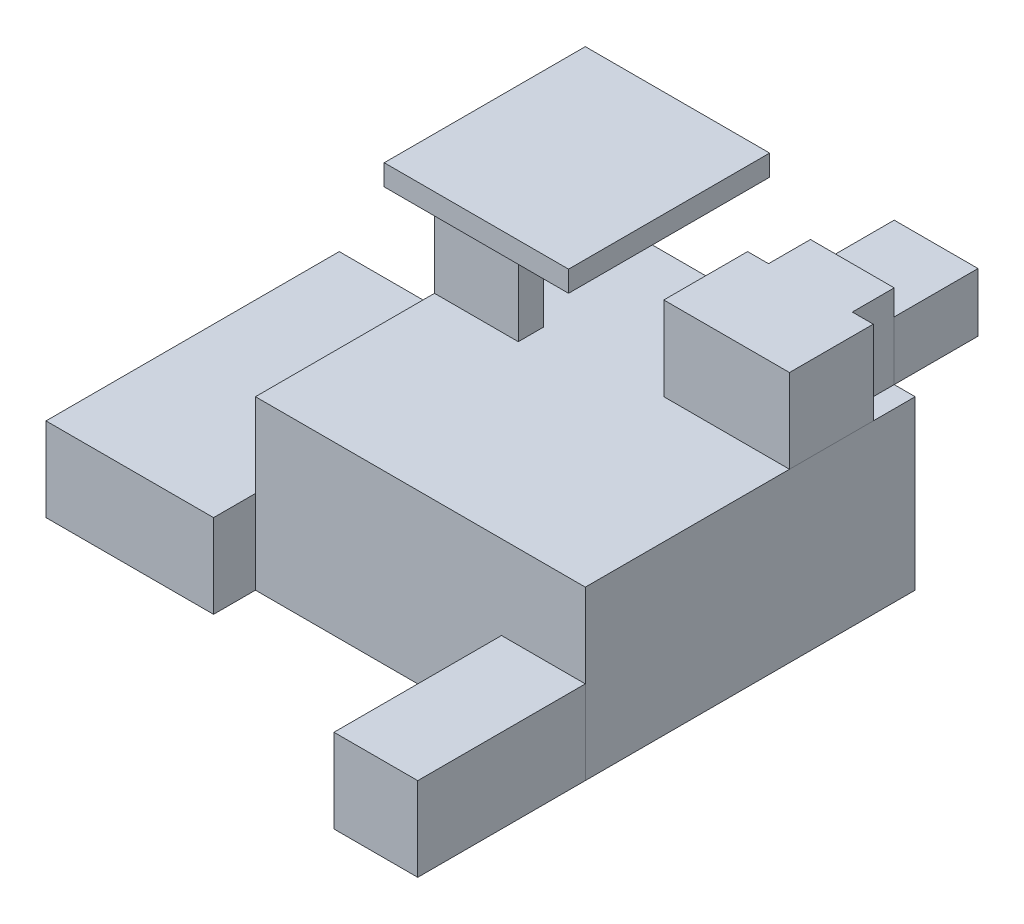
ISO-10303-21;
HEADER;
FILE_DESCRIPTION(('STEP AP214'),'2;1');
FILE_NAME('part.step','',(''),(''),'','','');
FILE_SCHEMA(('AUTOMOTIVE_DESIGN { 1 0 10303 214 1 1 1 1 }'));
ENDSEC;
DATA;
#1=APPLICATION_CONTEXT('core data for automotive mechanical design processes');
#2=APPLICATION_PROTOCOL_DEFINITION('international standard','automotive_design',2000,#1);
#3=PRODUCT_CONTEXT('',#1,'mechanical');
#4=PRODUCT('Part','Part','',(#3));
#5=PRODUCT_RELATED_PRODUCT_CATEGORY('part','',(#4));
#6=PRODUCT_DEFINITION_FORMATION('','',#4);
#7=PRODUCT_DEFINITION_CONTEXT('part definition',#1,'design');
#8=PRODUCT_DEFINITION('design','',#6,#7);
#9=PRODUCT_DEFINITION_SHAPE('','',#8);
#10=(LENGTH_UNIT() NAMED_UNIT(*) SI_UNIT(.MILLI.,.METRE.));
#11=(NAMED_UNIT(*) PLANE_ANGLE_UNIT() SI_UNIT($,.RADIAN.));
#12=(NAMED_UNIT(*) SI_UNIT($,.STERADIAN.) SOLID_ANGLE_UNIT());
#13=UNCERTAINTY_MEASURE_WITH_UNIT(LENGTH_MEASURE(1.E-05),#10,'distance_accuracy_value','');
#14=(GEOMETRIC_REPRESENTATION_CONTEXT(3) GLOBAL_UNCERTAINTY_ASSIGNED_CONTEXT((#13)) GLOBAL_UNIT_ASSIGNED_CONTEXT((#10,
#11,#12)) REPRESENTATION_CONTEXT('',''));
#15=CARTESIAN_POINT('',(0.,0.,0.));
#16=DIRECTION('',(0.,0.,1.));
#17=DIRECTION('',(1.,0.,0.));
#18=AXIS2_PLACEMENT_3D('',#15,#16,#17);
#19=CARTESIAN_POINT('',(21.59,40.005,-25.87));
#20=DIRECTION('',(-1.,0.,0.));
#21=DIRECTION('',(0.,0.,1.));
#22=AXIS2_PLACEMENT_3D('',#19,#20,#21);
#23=PLANE('',#22);
#24=DIRECTION('',(0.,0.,-1.));
#25=VECTOR('',#24,1.);
#26=CARTESIAN_POINT('',(21.59,36.83,-25.87));
#27=LINE('',#26,#25);
#28=CARTESIAN_POINT('',(21.59,36.83,-25.87));
#29=VERTEX_POINT('',#28);
#30=CARTESIAN_POINT('',(21.59,36.83,-56.35));
#31=VERTEX_POINT('',#30);
#32=EDGE_CURVE('E106',#29,#31,#27,.T.);
#33=ORIENTED_EDGE('',*,*,#32,.T.);
#34=DIRECTION('',(0.,-1.,0.));
#35=VECTOR('',#34,1.);
#36=CARTESIAN_POINT('',(21.59,40.005,-56.35));
#37=LINE('',#36,#35);
#38=CARTESIAN_POINT('',(21.59,40.005,-56.35));
#39=VERTEX_POINT('',#38);
#40=EDGE_CURVE('E12',#39,#31,#37,.T.);
#41=ORIENTED_EDGE('',*,*,#40,.F.);
#42=DIRECTION('',(0.,0.,-1.));
#43=VECTOR('',#42,1.);
#44=CARTESIAN_POINT('',(21.59,40.005,-25.87));
#45=LINE('',#44,#43);
#46=CARTESIAN_POINT('',(21.59,40.005,-25.87));
#47=VERTEX_POINT('',#46);
#48=EDGE_CURVE('E94',#47,#39,#45,.T.);
#49=ORIENTED_EDGE('',*,*,#48,.F.);
#50=DIRECTION('',(0.,-1.,0.));
#51=VECTOR('',#50,1.);
#52=CARTESIAN_POINT('',(21.59,40.005,-25.87));
#53=LINE('',#52,#51);
#54=EDGE_CURVE('E102',#47,#29,#53,.T.);
#55=ORIENTED_EDGE('',*,*,#54,.T.);
#56=EDGE_LOOP('',(#33,#41,#49,#55));
#57=FACE_BOUND('',#56,.T.);
#58=ADVANCED_FACE('F43',(#57),#23,.F.);
#59=CARTESIAN_POINT('',(21.59,40.005,-56.35));
#60=DIRECTION('',(0.,0.,1.));
#61=DIRECTION('',(1.,0.,0.));
#62=AXIS2_PLACEMENT_3D('',#59,#60,#61);
#63=PLANE('',#62);
#64=DIRECTION('',(-1.,0.,0.));
#65=VECTOR('',#64,1.);
#66=CARTESIAN_POINT('',(21.59,36.83,-56.35));
#67=LINE('',#66,#65);
#68=CARTESIAN_POINT('',(-6.35,36.83,-56.35));
#69=VERTEX_POINT('',#68);
#70=EDGE_CURVE('E98',#31,#69,#67,.T.);
#71=ORIENTED_EDGE('',*,*,#70,.T.);
#72=DIRECTION('',(0.,-1.,0.));
#73=VECTOR('',#72,1.);
#74=CARTESIAN_POINT('',(-6.35,40.005,-56.35));
#75=LINE('',#74,#73);
#76=CARTESIAN_POINT('',(-6.35,40.005,-56.35));
#77=VERTEX_POINT('',#76);
#78=EDGE_CURVE('E51',#77,#69,#75,.T.);
#79=ORIENTED_EDGE('',*,*,#78,.F.);
#80=DIRECTION('',(-1.,0.,0.));
#81=VECTOR('',#80,1.);
#82=CARTESIAN_POINT('',(21.59,40.005,-56.35));
#83=LINE('',#82,#81);
#84=EDGE_CURVE('E89',#39,#77,#83,.T.);
#85=ORIENTED_EDGE('',*,*,#84,.F.);
#86=ORIENTED_EDGE('',*,*,#40,.T.);
#87=EDGE_LOOP('',(#71,#79,#85,#86));
#88=FACE_BOUND('',#87,.T.);
#89=ADVANCED_FACE('F97',(#88),#63,.F.);
#90=CARTESIAN_POINT('',(-6.35,40.005,-25.87));
#91=DIRECTION('',(1.,0.,0.));
#92=DIRECTION('',(0.,0.,-1.));
#93=AXIS2_PLACEMENT_3D('',#90,#91,#92);
#94=PLANE('',#93);
#95=DIRECTION('',(0.,0.,1.));
#96=VECTOR('',#95,1.);
#97=CARTESIAN_POINT('',(-6.35,36.83,-25.87));
#98=LINE('',#97,#96);
#99=CARTESIAN_POINT('',(-6.35,36.83,-25.87));
#100=VERTEX_POINT('',#99);
#101=EDGE_CURVE('E76',#69,#100,#98,.T.);
#102=ORIENTED_EDGE('',*,*,#101,.T.);
#103=DIRECTION('',(0.,-1.,0.));
#104=VECTOR('',#103,1.);
#105=CARTESIAN_POINT('',(-6.35,40.005,-25.87));
#106=LINE('',#105,#104);
#107=CARTESIAN_POINT('',(-6.35,40.005,-25.87));
#108=VERTEX_POINT('',#107);
#109=EDGE_CURVE('E99',#108,#100,#106,.T.);
#110=ORIENTED_EDGE('',*,*,#109,.F.);
#111=DIRECTION('',(0.,0.,1.));
#112=VECTOR('',#111,1.);
#113=CARTESIAN_POINT('',(-6.35,40.005,-25.87));
#114=LINE('',#113,#112);
#115=EDGE_CURVE('E92',#77,#108,#114,.T.);
#116=ORIENTED_EDGE('',*,*,#115,.F.);
#117=ORIENTED_EDGE('',*,*,#78,.T.);
#118=EDGE_LOOP('',(#102,#110,#116,#117));
#119=FACE_BOUND('',#118,.T.);
#120=ADVANCED_FACE('F100',(#119),#94,.F.);
#121=CARTESIAN_POINT('',(21.59,40.005,-25.87));
#122=DIRECTION('',(0.,0.,-1.));
#123=DIRECTION('',(-1.,0.,0.));
#124=AXIS2_PLACEMENT_3D('',#121,#122,#123);
#125=PLANE('',#124);
#126=DIRECTION('',(1.,0.,0.));
#127=VECTOR('',#126,1.);
#128=CARTESIAN_POINT('',(21.59,36.83,-25.87));
#129=LINE('',#128,#127);
#130=EDGE_CURVE('E82',#100,#29,#129,.T.);
#131=ORIENTED_EDGE('',*,*,#130,.T.);
#132=ORIENTED_EDGE('',*,*,#54,.F.);
#133=DIRECTION('',(1.,0.,0.));
#134=VECTOR('',#133,1.);
#135=CARTESIAN_POINT('',(21.59,40.005,-25.87));
#136=LINE('',#135,#134);
#137=EDGE_CURVE('E59',#108,#47,#136,.T.);
#138=ORIENTED_EDGE('',*,*,#137,.F.);
#139=ORIENTED_EDGE('',*,*,#109,.T.);
#140=EDGE_LOOP('',(#131,#132,#138,#139));
#141=FACE_BOUND('',#140,.T.);
#142=ADVANCED_FACE('F113',(#141),#125,.F.);
#143=CARTESIAN_POINT('',(0.,40.005,0.));
#144=DIRECTION('',(0.,1.,0.));
#145=DIRECTION('',(0.,0.,1.));
#146=AXIS2_PLACEMENT_3D('',#143,#144,#145);
#147=PLANE('',#146);
#148=ORIENTED_EDGE('',*,*,#48,.T.);
#149=ORIENTED_EDGE('',*,*,#84,.T.);
#150=ORIENTED_EDGE('',*,*,#115,.T.);
#151=ORIENTED_EDGE('',*,*,#137,.T.);
#152=EDGE_LOOP('',(#148,#149,#150,#151));
#153=FACE_BOUND('',#152,.T.);
#154=ADVANCED_FACE('F90',(#153),#147,.T.);
#155=CARTESIAN_POINT('',(0.,36.83,0.));
#156=DIRECTION('',(0.,1.,0.));
#157=DIRECTION('',(0.,0.,1.));
#158=AXIS2_PLACEMENT_3D('',#155,#156,#157);
#159=PLANE('',#158);
#160=ORIENTED_EDGE('',*,*,#32,.F.);
#161=ORIENTED_EDGE('',*,*,#130,.F.);
#162=ORIENTED_EDGE('',*,*,#101,.F.);
#163=ORIENTED_EDGE('',*,*,#70,.F.);
#164=EDGE_LOOP('',(#160,#161,#162,#163));
#165=FACE_BOUND('',#164,.T.);
#166=ADVANCED_FACE('F116',(#165),#159,.F.);
#167=CLOSED_SHELL('',(#58,#89,#120,#142,#154,#166));
#168=MANIFOLD_SOLID_BREP('B2',#167);
#169=CARTESIAN_POINT('',(12.7,36.83,-30.95));
#170=DIRECTION('',(-1.,0.,0.));
#171=DIRECTION('',(0.,0.,1.));
#172=AXIS2_PLACEMENT_3D('',#169,#170,#171);
#173=PLANE('',#172);
#174=DIRECTION('',(0.,0.,-1.));
#175=VECTOR('',#174,1.);
#176=CARTESIAN_POINT('',(12.7,25.4,-30.95));
#177=LINE('',#176,#175);
#178=CARTESIAN_POINT('',(12.7,25.4,-27.14));
#179=VERTEX_POINT('',#178);
#180=CARTESIAN_POINT('',(12.7,25.4,-30.95));
#181=VERTEX_POINT('',#180);
#182=EDGE_CURVE('E239',#179,#181,#177,.T.);
#183=ORIENTED_EDGE('',*,*,#182,.T.);
#184=DIRECTION('',(0.,-1.,0.));
#185=VECTOR('',#184,1.);
#186=CARTESIAN_POINT('',(12.7,36.83,-30.95));
#187=LINE('',#186,#185);
#188=CARTESIAN_POINT('',(12.7,36.83,-30.95));
#189=VERTEX_POINT('',#188);
#190=EDGE_CURVE('E41',#189,#181,#187,.T.);
#191=ORIENTED_EDGE('',*,*,#190,.F.);
#192=DIRECTION('',(0.,0.,-1.));
#193=VECTOR('',#192,1.);
#194=CARTESIAN_POINT('',(12.7,36.83,-30.95));
#195=LINE('',#194,#193);
#196=CARTESIAN_POINT('',(12.7,36.83,-27.14));
#197=VERTEX_POINT('',#196);
#198=EDGE_CURVE('E227',#197,#189,#195,.T.);
#199=ORIENTED_EDGE('',*,*,#198,.F.);
#200=DIRECTION('',(0.,-1.,0.));
#201=VECTOR('',#200,1.);
#202=CARTESIAN_POINT('',(12.7,36.83,-27.14));
#203=LINE('',#202,#201);
#204=EDGE_CURVE('E235',#197,#179,#203,.T.);
#205=ORIENTED_EDGE('',*,*,#204,.T.);
#206=EDGE_LOOP('',(#183,#191,#199,#205));
#207=FACE_BOUND('',#206,.T.);
#208=ADVANCED_FACE('F176',(#207),#173,.F.);
#209=CARTESIAN_POINT('',(12.7,36.83,-30.95));
#210=DIRECTION('',(0.,0.,1.));
#211=DIRECTION('',(1.,0.,0.));
#212=AXIS2_PLACEMENT_3D('',#209,#210,#211);
#213=PLANE('',#212);
#214=DIRECTION('',(-1.,0.,0.));
#215=VECTOR('',#214,1.);
#216=CARTESIAN_POINT('',(12.7,25.4,-30.95));
#217=LINE('',#216,#215);
#218=CARTESIAN_POINT('',(0.,25.4,-30.95));
#219=VERTEX_POINT('',#218);
#220=EDGE_CURVE('E231',#181,#219,#217,.T.);
#221=ORIENTED_EDGE('',*,*,#220,.T.);
#222=DIRECTION('',(0.,-1.,0.));
#223=VECTOR('',#222,1.);
#224=CARTESIAN_POINT('',(0.,36.83,-30.95));
#225=LINE('',#224,#223);
#226=CARTESIAN_POINT('',(0.,36.83,-30.95));
#227=VERTEX_POINT('',#226);
#228=EDGE_CURVE('E184',#227,#219,#225,.T.);
#229=ORIENTED_EDGE('',*,*,#228,.F.);
#230=DIRECTION('',(-1.,0.,0.));
#231=VECTOR('',#230,1.);
#232=CARTESIAN_POINT('',(12.7,36.83,-30.95));
#233=LINE('',#232,#231);
#234=EDGE_CURVE('E222',#189,#227,#233,.T.);
#235=ORIENTED_EDGE('',*,*,#234,.F.);
#236=ORIENTED_EDGE('',*,*,#190,.T.);
#237=EDGE_LOOP('',(#221,#229,#235,#236));
#238=FACE_BOUND('',#237,.T.);
#239=ADVANCED_FACE('F230',(#238),#213,.F.);
#240=CARTESIAN_POINT('',(0.,36.83,-30.95));
#241=DIRECTION('',(1.,0.,0.));
#242=DIRECTION('',(0.,0.,-1.));
#243=AXIS2_PLACEMENT_3D('',#240,#241,#242);
#244=PLANE('',#243);
#245=DIRECTION('',(0.,0.,1.));
#246=VECTOR('',#245,1.);
#247=CARTESIAN_POINT('',(0.,25.4,-30.95));
#248=LINE('',#247,#246);
#249=CARTESIAN_POINT('',(0.,25.4,-27.14));
#250=VERTEX_POINT('',#249);
#251=EDGE_CURVE('E209',#219,#250,#248,.T.);
#252=ORIENTED_EDGE('',*,*,#251,.T.);
#253=DIRECTION('',(0.,-1.,0.));
#254=VECTOR('',#253,1.);
#255=CARTESIAN_POINT('',(0.,36.83,-27.14));
#256=LINE('',#255,#254);
#257=CARTESIAN_POINT('',(0.,36.83,-27.14));
#258=VERTEX_POINT('',#257);
#259=EDGE_CURVE('E232',#258,#250,#256,.T.);
#260=ORIENTED_EDGE('',*,*,#259,.F.);
#261=DIRECTION('',(0.,0.,1.));
#262=VECTOR('',#261,1.);
#263=CARTESIAN_POINT('',(0.,36.83,-30.95));
#264=LINE('',#263,#262);
#265=EDGE_CURVE('E225',#227,#258,#264,.T.);
#266=ORIENTED_EDGE('',*,*,#265,.F.);
#267=ORIENTED_EDGE('',*,*,#228,.T.);
#268=EDGE_LOOP('',(#252,#260,#266,#267));
#269=FACE_BOUND('',#268,.T.);
#270=ADVANCED_FACE('F233',(#269),#244,.F.);
#271=CARTESIAN_POINT('',(12.7,36.83,-27.14));
#272=DIRECTION('',(0.,0.,-1.));
#273=DIRECTION('',(-1.,0.,0.));
#274=AXIS2_PLACEMENT_3D('',#271,#272,#273);
#275=PLANE('',#274);
#276=DIRECTION('',(1.,0.,0.));
#277=VECTOR('',#276,1.);
#278=CARTESIAN_POINT('',(12.7,25.4,-27.14));
#279=LINE('',#278,#277);
#280=EDGE_CURVE('E215',#250,#179,#279,.T.);
#281=ORIENTED_EDGE('',*,*,#280,.T.);
#282=ORIENTED_EDGE('',*,*,#204,.F.);
#283=DIRECTION('',(1.,0.,0.));
#284=VECTOR('',#283,1.);
#285=CARTESIAN_POINT('',(12.7,36.83,-27.14));
#286=LINE('',#285,#284);
#287=EDGE_CURVE('E192',#258,#197,#286,.T.);
#288=ORIENTED_EDGE('',*,*,#287,.F.);
#289=ORIENTED_EDGE('',*,*,#259,.T.);
#290=EDGE_LOOP('',(#281,#282,#288,#289));
#291=FACE_BOUND('',#290,.T.);
#292=ADVANCED_FACE('F246',(#291),#275,.F.);
#293=CARTESIAN_POINT('',(0.,36.83,0.));
#294=DIRECTION('',(0.,-1.,0.));
#295=DIRECTION('',(0.,0.,-1.));
#296=AXIS2_PLACEMENT_3D('',#293,#294,#295);
#297=PLANE('',#296);
#298=ORIENTED_EDGE('',*,*,#198,.T.);
#299=ORIENTED_EDGE('',*,*,#234,.T.);
#300=ORIENTED_EDGE('',*,*,#265,.T.);
#301=ORIENTED_EDGE('',*,*,#287,.T.);
#302=EDGE_LOOP('',(#298,#299,#300,#301));
#303=FACE_BOUND('',#302,.T.);
#304=ADVANCED_FACE('F223',(#303),#297,.F.);
#305=CARTESIAN_POINT('',(0.,25.4,0.));
#306=DIRECTION('',(0.,-1.,0.));
#307=DIRECTION('',(0.,0.,-1.));
#308=AXIS2_PLACEMENT_3D('',#305,#306,#307);
#309=PLANE('',#308);
#310=ORIENTED_EDGE('',*,*,#182,.F.);
#311=ORIENTED_EDGE('',*,*,#280,.F.);
#312=ORIENTED_EDGE('',*,*,#251,.F.);
#313=ORIENTED_EDGE('',*,*,#220,.F.);
#314=EDGE_LOOP('',(#310,#311,#312,#313));
#315=FACE_BOUND('',#314,.T.);
#316=ADVANCED_FACE('F249',(#315),#309,.T.);
#317=CLOSED_SHELL('',(#208,#239,#270,#292,#304,#316));
#318=MANIFOLD_SOLID_BREP('B6',#317);
#319=CARTESIAN_POINT('',(46.825,34.29,-50.));
#320=DIRECTION('',(-1.,0.,0.));
#321=DIRECTION('',(0.,0.,1.));
#322=AXIS2_PLACEMENT_3D('',#319,#320,#321);
#323=PLANE('',#322);
#324=DIRECTION('',(0.,0.,-1.));
#325=VECTOR('',#324,1.);
#326=CARTESIAN_POINT('',(46.825,25.4,-50.));
#327=LINE('',#326,#325);
#328=CARTESIAN_POINT('',(46.825,25.4,-50.));
#329=VERTEX_POINT('',#328);
#330=CARTESIAN_POINT('',(46.825,25.4,-62.7));
#331=VERTEX_POINT('',#330);
#332=EDGE_CURVE('E372',#329,#331,#327,.T.);
#333=ORIENTED_EDGE('',*,*,#332,.T.);
#334=DIRECTION('',(0.,-1.,0.));
#335=VECTOR('',#334,1.);
#336=CARTESIAN_POINT('',(46.825,34.29,-62.7));
#337=LINE('',#336,#335);
#338=CARTESIAN_POINT('',(46.825,34.29,-62.7));
#339=VERTEX_POINT('',#338);
#340=EDGE_CURVE('E174',#339,#331,#337,.T.);
#341=ORIENTED_EDGE('',*,*,#340,.F.);
#342=DIRECTION('',(0.,0.,-1.));
#343=VECTOR('',#342,1.);
#344=CARTESIAN_POINT('',(46.825,34.29,-50.));
#345=LINE('',#344,#343);
#346=CARTESIAN_POINT('',(46.825,34.29,-50.));
#347=VERTEX_POINT('',#346);
#348=EDGE_CURVE('E360',#347,#339,#345,.T.);
#349=ORIENTED_EDGE('',*,*,#348,.F.);
#350=DIRECTION('',(0.,-1.,0.));
#351=VECTOR('',#350,1.);
#352=CARTESIAN_POINT('',(46.825,34.29,-50.));
#353=LINE('',#352,#351);
#354=EDGE_CURVE('E368',#347,#329,#353,.T.);
#355=ORIENTED_EDGE('',*,*,#354,.T.);
#356=EDGE_LOOP('',(#333,#341,#349,#355));
#357=FACE_BOUND('',#356,.T.);
#358=ADVANCED_FACE('F309',(#357),#323,.F.);
#359=CARTESIAN_POINT('',(46.825,34.29,-62.7));
#360=DIRECTION('',(0.,0.,1.));
#361=DIRECTION('',(1.,0.,0.));
#362=AXIS2_PLACEMENT_3D('',#359,#360,#361);
#363=PLANE('',#362);
#364=DIRECTION('',(-1.,0.,0.));
#365=VECTOR('',#364,1.);
#366=CARTESIAN_POINT('',(46.825,25.4,-62.7));
#367=LINE('',#366,#365);
#368=CARTESIAN_POINT('',(34.125,25.4,-62.7));
#369=VERTEX_POINT('',#368);
#370=EDGE_CURVE('E364',#331,#369,#367,.T.);
#371=ORIENTED_EDGE('',*,*,#370,.T.);
#372=DIRECTION('',(0.,-1.,0.));
#373=VECTOR('',#372,1.);
#374=CARTESIAN_POINT('',(34.125,34.29,-62.7));
#375=LINE('',#374,#373);
#376=CARTESIAN_POINT('',(34.125,34.29,-62.7));
#377=VERTEX_POINT('',#376);
#378=EDGE_CURVE('E317',#377,#369,#375,.T.);
#379=ORIENTED_EDGE('',*,*,#378,.F.);
#380=DIRECTION('',(-1.,0.,0.));
#381=VECTOR('',#380,1.);
#382=CARTESIAN_POINT('',(46.825,34.29,-62.7));
#383=LINE('',#382,#381);
#384=EDGE_CURVE('E355',#339,#377,#383,.T.);
#385=ORIENTED_EDGE('',*,*,#384,.F.);
#386=ORIENTED_EDGE('',*,*,#340,.T.);
#387=EDGE_LOOP('',(#371,#379,#385,#386));
#388=FACE_BOUND('',#387,.T.);
#389=ADVANCED_FACE('F363',(#388),#363,.F.);
#390=CARTESIAN_POINT('',(34.125,34.29,-50.));
#391=DIRECTION('',(1.,0.,0.));
#392=DIRECTION('',(0.,0.,-1.));
#393=AXIS2_PLACEMENT_3D('',#390,#391,#392);
#394=PLANE('',#393);
#395=DIRECTION('',(0.,0.,1.));
#396=VECTOR('',#395,1.);
#397=CARTESIAN_POINT('',(34.125,25.4,-50.));
#398=LINE('',#397,#396);
#399=CARTESIAN_POINT('',(34.125,25.4,-50.));
#400=VERTEX_POINT('',#399);
#401=EDGE_CURVE('E342',#369,#400,#398,.T.);
#402=ORIENTED_EDGE('',*,*,#401,.T.);
#403=DIRECTION('',(0.,-1.,0.));
#404=VECTOR('',#403,1.);
#405=CARTESIAN_POINT('',(34.125,34.29,-50.));
#406=LINE('',#405,#404);
#407=CARTESIAN_POINT('',(34.125,34.29,-50.));
#408=VERTEX_POINT('',#407);
#409=EDGE_CURVE('E365',#408,#400,#406,.T.);
#410=ORIENTED_EDGE('',*,*,#409,.F.);
#411=DIRECTION('',(0.,0.,1.));
#412=VECTOR('',#411,1.);
#413=CARTESIAN_POINT('',(34.125,34.29,-50.));
#414=LINE('',#413,#412);
#415=EDGE_CURVE('E358',#377,#408,#414,.T.);
#416=ORIENTED_EDGE('',*,*,#415,.F.);
#417=ORIENTED_EDGE('',*,*,#378,.T.);
#418=EDGE_LOOP('',(#402,#410,#416,#417));
#419=FACE_BOUND('',#418,.T.);
#420=ADVANCED_FACE('F366',(#419),#394,.F.);
#421=CARTESIAN_POINT('',(46.825,34.29,-50.));
#422=DIRECTION('',(0.,0.,-1.));
#423=DIRECTION('',(-1.,0.,0.));
#424=AXIS2_PLACEMENT_3D('',#421,#422,#423);
#425=PLANE('',#424);
#426=DIRECTION('',(1.,0.,0.));
#427=VECTOR('',#426,1.);
#428=CARTESIAN_POINT('',(46.825,25.4,-50.));
#429=LINE('',#428,#427);
#430=EDGE_CURVE('E348',#400,#329,#429,.T.);
#431=ORIENTED_EDGE('',*,*,#430,.T.);
#432=ORIENTED_EDGE('',*,*,#354,.F.);
#433=DIRECTION('',(1.,0.,0.));
#434=VECTOR('',#433,1.);
#435=CARTESIAN_POINT('',(46.825,34.29,-50.));
#436=LINE('',#435,#434);
#437=EDGE_CURVE('E325',#408,#347,#436,.T.);
#438=ORIENTED_EDGE('',*,*,#437,.F.);
#439=ORIENTED_EDGE('',*,*,#409,.T.);
#440=EDGE_LOOP('',(#431,#432,#438,#439));
#441=FACE_BOUND('',#440,.T.);
#442=ADVANCED_FACE('F379',(#441),#425,.F.);
#443=CARTESIAN_POINT('',(0.,34.29,0.));
#444=DIRECTION('',(0.,1.,0.));
#445=DIRECTION('',(0.,0.,1.));
#446=AXIS2_PLACEMENT_3D('',#443,#444,#445);
#447=PLANE('',#446);
#448=ORIENTED_EDGE('',*,*,#348,.T.);
#449=ORIENTED_EDGE('',*,*,#384,.T.);
#450=ORIENTED_EDGE('',*,*,#415,.T.);
#451=ORIENTED_EDGE('',*,*,#437,.T.);
#452=EDGE_LOOP('',(#448,#449,#450,#451));
#453=FACE_BOUND('',#452,.T.);
#454=ADVANCED_FACE('F356',(#453),#447,.T.);
#455=CARTESIAN_POINT('',(0.,25.4,0.));
#456=DIRECTION('',(0.,1.,0.));
#457=DIRECTION('',(0.,0.,1.));
#458=AXIS2_PLACEMENT_3D('',#455,#456,#457);
#459=PLANE('',#458);
#460=ORIENTED_EDGE('',*,*,#332,.F.);
#461=ORIENTED_EDGE('',*,*,#430,.F.);
#462=ORIENTED_EDGE('',*,*,#401,.F.);
#463=ORIENTED_EDGE('',*,*,#370,.F.);
#464=EDGE_LOOP('',(#460,#461,#462,#463));
#465=FACE_BOUND('',#464,.T.);
#466=ADVANCED_FACE('F382',(#465),#459,.F.);
#467=CLOSED_SHELL('',(#358,#389,#420,#442,#454,#466));
#468=MANIFOLD_SOLID_BREP('B35',#467);
#469=CARTESIAN_POINT('',(50.,38.1,-43.65));
#470=DIRECTION('',(-1.,0.,0.));
#471=DIRECTION('',(0.,0.,1.));
#472=AXIS2_PLACEMENT_3D('',#469,#470,#471);
#473=PLANE('',#472);
#474=DIRECTION('',(0.,0.,-1.));
#475=VECTOR('',#474,1.);
#476=CARTESIAN_POINT('',(50.,25.4,-43.65));
#477=LINE('',#476,#475);
#478=CARTESIAN_POINT('',(50.,25.4,-30.95));
#479=VERTEX_POINT('',#478);
#480=CARTESIAN_POINT('',(50.,25.4,-43.65));
#481=VERTEX_POINT('',#480);
#482=EDGE_CURVE('E538',#479,#481,#477,.T.);
#483=ORIENTED_EDGE('',*,*,#482,.T.);
#484=DIRECTION('',(0.,-1.,0.));
#485=VECTOR('',#484,1.);
#486=CARTESIAN_POINT('',(50.,38.1,-43.65));
#487=LINE('',#486,#485);
#488=CARTESIAN_POINT('',(50.,38.1,-43.65));
#489=VERTEX_POINT('',#488);
#490=EDGE_CURVE('E307',#489,#481,#487,.T.);
#491=ORIENTED_EDGE('',*,*,#490,.F.);
#492=DIRECTION('',(0.,0.,-1.));
#493=VECTOR('',#492,1.);
#494=CARTESIAN_POINT('',(50.,38.1,-43.65));
#495=LINE('',#494,#493);
#496=CARTESIAN_POINT('',(50.,38.1,-30.95));
#497=VERTEX_POINT('',#496);
#498=EDGE_CURVE('E552',#497,#489,#495,.T.);
#499=ORIENTED_EDGE('',*,*,#498,.F.);
#500=DIRECTION('',(0.,-1.,0.));
#501=VECTOR('',#500,1.);
#502=CARTESIAN_POINT('',(50.,38.1,-30.95));
#503=LINE('',#502,#501);
#504=EDGE_CURVE('E534',#497,#479,#503,.T.);
#505=ORIENTED_EDGE('',*,*,#504,.T.);
#506=EDGE_LOOP('',(#483,#491,#499,#505));
#507=FACE_BOUND('',#506,.T.);
#508=ADVANCED_FACE('F442',(#507),#473,.F.);
#509=CARTESIAN_POINT('',(50.,38.1,-43.65));
#510=DIRECTION('',(0.,0.,1.));
#511=DIRECTION('',(1.,0.,0.));
#512=AXIS2_PLACEMENT_3D('',#509,#510,#511);
#513=PLANE('',#512);
#514=DIRECTION('',(-1.,0.,0.));
#515=VECTOR('',#514,1.);
#516=CARTESIAN_POINT('',(50.,25.4,-43.65));
#517=LINE('',#516,#515);
#518=CARTESIAN_POINT('',(46.825,25.4,-43.65));
#519=VERTEX_POINT('',#518);
#520=EDGE_CURVE('E541',#481,#519,#517,.T.);
#521=ORIENTED_EDGE('',*,*,#520,.T.);
#522=DIRECTION('',(0.,-1.,0.));
#523=VECTOR('',#522,1.);
#524=CARTESIAN_POINT('',(46.825,38.1,-43.65));
#525=LINE('',#524,#523);
#526=CARTESIAN_POINT('',(46.825,38.1,-43.65));
#527=VERTEX_POINT('',#526);
#528=EDGE_CURVE('E450',#527,#519,#525,.T.);
#529=ORIENTED_EDGE('',*,*,#528,.F.);
#530=DIRECTION('',(-1.,0.,0.));
#531=VECTOR('',#530,1.);
#532=CARTESIAN_POINT('',(50.,38.1,-43.65));
#533=LINE('',#532,#531);
#534=EDGE_CURVE('E501',#489,#527,#533,.T.);
#535=ORIENTED_EDGE('',*,*,#534,.F.);
#536=ORIENTED_EDGE('',*,*,#490,.T.);
#537=EDGE_LOOP('',(#521,#529,#535,#536));
#538=FACE_BOUND('',#537,.T.);
#539=ADVANCED_FACE('F587',(#538),#513,.F.);
#540=CARTESIAN_POINT('',(46.825,38.1,-43.65));
#541=DIRECTION('',(-1.,0.,0.));
#542=DIRECTION('',(0.,0.,1.));
#543=AXIS2_PLACEMENT_3D('',#540,#541,#542);
#544=PLANE('',#543);
#545=DIRECTION('',(0.,0.,-1.));
#546=VECTOR('',#545,1.);
#547=CARTESIAN_POINT('',(46.825,25.4,-43.65));
#548=LINE('',#547,#546);
#549=CARTESIAN_POINT('',(46.825,25.4,-50.));
#550=VERTEX_POINT('',#549);
#551=EDGE_CURVE('E543',#519,#550,#548,.T.);
#552=ORIENTED_EDGE('',*,*,#551,.T.);
#553=DIRECTION('',(0.,-1.,0.));
#554=VECTOR('',#553,1.);
#555=CARTESIAN_POINT('',(46.825,38.1,-50.));
#556=LINE('',#555,#554);
#557=CARTESIAN_POINT('',(46.825,38.1,-50.));
#558=VERTEX_POINT('',#557);
#559=EDGE_CURVE('E559',#558,#550,#556,.T.);
#560=ORIENTED_EDGE('',*,*,#559,.F.);
#561=DIRECTION('',(0.,0.,-1.));
#562=VECTOR('',#561,1.);
#563=CARTESIAN_POINT('',(46.825,38.1,-43.65));
#564=LINE('',#563,#562);
#565=EDGE_CURVE('E567',#527,#558,#564,.T.);
#566=ORIENTED_EDGE('',*,*,#565,.F.);
#567=ORIENTED_EDGE('',*,*,#528,.T.);
#568=EDGE_LOOP('',(#552,#560,#566,#567));
#569=FACE_BOUND('',#568,.T.);
#570=ADVANCED_FACE('F565',(#569),#544,.F.);
#571=CARTESIAN_POINT('',(46.825,38.1,-50.));
#572=DIRECTION('',(0.,0.,1.));
#573=DIRECTION('',(1.,0.,0.));
#574=AXIS2_PLACEMENT_3D('',#571,#572,#573);
#575=PLANE('',#574);
#576=DIRECTION('',(-1.,0.,0.));
#577=VECTOR('',#576,1.);
#578=CARTESIAN_POINT('',(46.825,25.4,-50.));
#579=LINE('',#578,#577);
#580=CARTESIAN_POINT('',(34.125,25.4,-50.));
#581=VERTEX_POINT('',#580);
#582=EDGE_CURVE('E545',#550,#581,#579,.T.);
#583=ORIENTED_EDGE('',*,*,#582,.T.);
#584=DIRECTION('',(0.,-1.,0.));
#585=VECTOR('',#584,1.);
#586=CARTESIAN_POINT('',(34.125,38.1,-50.));
#587=LINE('',#586,#585);
#588=CARTESIAN_POINT('',(34.125,38.1,-50.));
#589=VERTEX_POINT('',#588);
#590=EDGE_CURVE('E556',#589,#581,#587,.T.);
#591=ORIENTED_EDGE('',*,*,#590,.F.);
#592=DIRECTION('',(-1.,0.,0.));
#593=VECTOR('',#592,1.);
#594=CARTESIAN_POINT('',(46.825,38.1,-50.));
#595=LINE('',#594,#593);
#596=EDGE_CURVE('E579',#558,#589,#595,.T.);
#597=ORIENTED_EDGE('',*,*,#596,.F.);
#598=ORIENTED_EDGE('',*,*,#559,.T.);
#599=EDGE_LOOP('',(#583,#591,#597,#598));
#600=FACE_BOUND('',#599,.T.);
#601=ADVANCED_FACE('F575',(#600),#575,.F.);
#602=CARTESIAN_POINT('',(34.125,38.1,-43.65));
#603=DIRECTION('',(1.,0.,0.));
#604=DIRECTION('',(0.,0.,-1.));
#605=AXIS2_PLACEMENT_3D('',#602,#603,#604);
#606=PLANE('',#605);
#607=DIRECTION('',(0.,0.,1.));
#608=VECTOR('',#607,1.);
#609=CARTESIAN_POINT('',(34.125,25.4,-43.65));
#610=LINE('',#609,#608);
#611=CARTESIAN_POINT('',(34.125,25.4,-43.65));
#612=VERTEX_POINT('',#611);
#613=EDGE_CURVE('E547',#581,#612,#610,.T.);
#614=ORIENTED_EDGE('',*,*,#613,.T.);
#615=DIRECTION('',(0.,-1.,0.));
#616=VECTOR('',#615,1.);
#617=CARTESIAN_POINT('',(34.125,38.1,-43.65));
#618=LINE('',#617,#616);
#619=CARTESIAN_POINT('',(34.125,38.1,-43.65));
#620=VERTEX_POINT('',#619);
#621=EDGE_CURVE('E529',#620,#612,#618,.T.);
#622=ORIENTED_EDGE('',*,*,#621,.F.);
#623=DIRECTION('',(0.,0.,1.));
#624=VECTOR('',#623,1.);
#625=CARTESIAN_POINT('',(34.125,38.1,-43.65));
#626=LINE('',#625,#624);
#627=EDGE_CURVE('E520',#589,#620,#626,.T.);
#628=ORIENTED_EDGE('',*,*,#627,.F.);
#629=ORIENTED_EDGE('',*,*,#590,.T.);
#630=EDGE_LOOP('',(#614,#622,#628,#629));
#631=FACE_BOUND('',#630,.T.);
#632=ADVANCED_FACE('F578',(#631),#606,.F.);
#633=CARTESIAN_POINT('',(34.125,38.1,-43.65));
#634=DIRECTION('',(0.,0.,1.));
#635=DIRECTION('',(1.,0.,0.));
#636=AXIS2_PLACEMENT_3D('',#633,#634,#635);
#637=PLANE('',#636);
#638=DIRECTION('',(-1.,0.,0.));
#639=VECTOR('',#638,1.);
#640=CARTESIAN_POINT('',(34.125,25.4,-43.65));
#641=LINE('',#640,#639);
#642=CARTESIAN_POINT('',(30.95,25.4,-43.65));
#643=VERTEX_POINT('',#642);
#644=EDGE_CURVE('E528',#612,#643,#641,.T.);
#645=ORIENTED_EDGE('',*,*,#644,.T.);
#646=DIRECTION('',(0.,-1.,0.));
#647=VECTOR('',#646,1.);
#648=CARTESIAN_POINT('',(30.95,38.1,-43.65));
#649=LINE('',#648,#647);
#650=CARTESIAN_POINT('',(30.95,38.1,-43.65));
#651=VERTEX_POINT('',#650);
#652=EDGE_CURVE('E525',#651,#643,#649,.T.);
#653=ORIENTED_EDGE('',*,*,#652,.F.);
#654=DIRECTION('',(-1.,0.,0.));
#655=VECTOR('',#654,1.);
#656=CARTESIAN_POINT('',(34.125,38.1,-43.65));
#657=LINE('',#656,#655);
#658=EDGE_CURVE('E514',#620,#651,#657,.T.);
#659=ORIENTED_EDGE('',*,*,#658,.F.);
#660=ORIENTED_EDGE('',*,*,#621,.T.);
#661=EDGE_LOOP('',(#645,#653,#659,#660));
#662=FACE_BOUND('',#661,.T.);
#663=ADVANCED_FACE('F526',(#662),#637,.F.);
#664=CARTESIAN_POINT('',(30.95,38.1,-43.65));
#665=DIRECTION('',(1.,0.,0.));
#666=DIRECTION('',(0.,0.,-1.));
#667=AXIS2_PLACEMENT_3D('',#664,#665,#666);
#668=PLANE('',#667);
#669=DIRECTION('',(0.,0.,1.));
#670=VECTOR('',#669,1.);
#671=CARTESIAN_POINT('',(30.95,25.4,-43.65));
#672=LINE('',#671,#670);
#673=CARTESIAN_POINT('',(30.95,25.4,-30.95));
#674=VERTEX_POINT('',#673);
#675=EDGE_CURVE('E487',#643,#674,#672,.T.);
#676=ORIENTED_EDGE('',*,*,#675,.T.);
#677=DIRECTION('',(0.,-1.,0.));
#678=VECTOR('',#677,1.);
#679=CARTESIAN_POINT('',(30.95,38.1,-30.95));
#680=LINE('',#679,#678);
#681=CARTESIAN_POINT('',(30.95,38.1,-30.95));
#682=VERTEX_POINT('',#681);
#683=EDGE_CURVE('E530',#682,#674,#680,.T.);
#684=ORIENTED_EDGE('',*,*,#683,.F.);
#685=DIRECTION('',(0.,0.,1.));
#686=VECTOR('',#685,1.);
#687=CARTESIAN_POINT('',(30.95,38.1,-43.65));
#688=LINE('',#687,#686);
#689=EDGE_CURVE('E518',#651,#682,#688,.T.);
#690=ORIENTED_EDGE('',*,*,#689,.F.);
#691=ORIENTED_EDGE('',*,*,#652,.T.);
#692=EDGE_LOOP('',(#676,#684,#690,#691));
#693=FACE_BOUND('',#692,.T.);
#694=ADVANCED_FACE('F532',(#693),#668,.F.);
#695=CARTESIAN_POINT('',(50.,38.1,-30.95));
#696=DIRECTION('',(0.,0.,-1.));
#697=DIRECTION('',(-1.,0.,0.));
#698=AXIS2_PLACEMENT_3D('',#695,#696,#697);
#699=PLANE('',#698);
#700=DIRECTION('',(1.,0.,0.));
#701=VECTOR('',#700,1.);
#702=CARTESIAN_POINT('',(50.,25.4,-30.95));
#703=LINE('',#702,#701);
#704=EDGE_CURVE('E493',#674,#479,#703,.T.);
#705=ORIENTED_EDGE('',*,*,#704,.T.);
#706=ORIENTED_EDGE('',*,*,#504,.F.);
#707=DIRECTION('',(1.,0.,0.));
#708=VECTOR('',#707,1.);
#709=CARTESIAN_POINT('',(50.,38.1,-30.95));
#710=LINE('',#709,#708);
#711=EDGE_CURVE('E458',#682,#497,#710,.T.);
#712=ORIENTED_EDGE('',*,*,#711,.F.);
#713=ORIENTED_EDGE('',*,*,#683,.T.);
#714=EDGE_LOOP('',(#705,#706,#712,#713));
#715=FACE_BOUND('',#714,.T.);
#716=ADVANCED_FACE('F603',(#715),#699,.F.);
#717=CARTESIAN_POINT('',(0.,38.1,0.));
#718=DIRECTION('',(0.,-1.,0.));
#719=DIRECTION('',(0.,0.,-1.));
#720=AXIS2_PLACEMENT_3D('',#717,#718,#719);
#721=PLANE('',#720);
#722=ORIENTED_EDGE('',*,*,#498,.T.);
#723=ORIENTED_EDGE('',*,*,#534,.T.);
#724=ORIENTED_EDGE('',*,*,#565,.T.);
#725=ORIENTED_EDGE('',*,*,#596,.T.);
#726=ORIENTED_EDGE('',*,*,#627,.T.);
#727=ORIENTED_EDGE('',*,*,#658,.T.);
#728=ORIENTED_EDGE('',*,*,#689,.T.);
#729=ORIENTED_EDGE('',*,*,#711,.T.);
#730=EDGE_LOOP('',(#722,#723,#724,#725,#726,#727,#728,#729));
#731=FACE_BOUND('',#730,.T.);
#732=ADVANCED_FACE('F516',(#731),#721,.F.);
#733=CARTESIAN_POINT('',(0.,25.4,0.));
#734=DIRECTION('',(0.,-1.,0.));
#735=DIRECTION('',(0.,0.,-1.));
#736=AXIS2_PLACEMENT_3D('',#733,#734,#735);
#737=PLANE('',#736);
#738=ORIENTED_EDGE('',*,*,#482,.F.);
#739=ORIENTED_EDGE('',*,*,#704,.F.);
#740=ORIENTED_EDGE('',*,*,#675,.F.);
#741=ORIENTED_EDGE('',*,*,#644,.F.);
#742=ORIENTED_EDGE('',*,*,#613,.F.);
#743=ORIENTED_EDGE('',*,*,#582,.F.);
#744=ORIENTED_EDGE('',*,*,#551,.F.);
#745=ORIENTED_EDGE('',*,*,#520,.F.);
#746=EDGE_LOOP('',(#738,#739,#740,#741,#742,#743,#744,#745));
#747=FACE_BOUND('',#746,.T.);
#748=ADVANCED_FACE('F571',(#747),#737,.T.);
#749=CLOSED_SHELL('',(#508,#539,#570,#601,#632,#663,#694,#716,#732,#748));
#750=MANIFOLD_SOLID_BREP('B168',#749);
#751=CARTESIAN_POINT('',(-25.4,0.,6.35));
#752=DIRECTION('',(0.,0.,-1.));
#753=DIRECTION('',(-1.,0.,0.));
#754=AXIS2_PLACEMENT_3D('',#751,#752,#753);
#755=PLANE('',#754);
#756=DIRECTION('',(0.,1.,0.));
#757=VECTOR('',#756,1.);
#758=CARTESIAN_POINT('',(0.,0.,6.35));
#759=LINE('',#758,#757);
#760=CARTESIAN_POINT('',(0.,0.,6.35));
#761=VERTEX_POINT('',#760);
#762=CARTESIAN_POINT('',(0.,12.7,6.35));
#763=VERTEX_POINT('',#762);
#764=EDGE_CURVE('E742',#761,#763,#759,.T.);
#765=ORIENTED_EDGE('',*,*,#764,.T.);
#766=DIRECTION('',(1.,0.,0.));
#767=VECTOR('',#766,1.);
#768=CARTESIAN_POINT('',(-25.4,12.7,6.35));
#769=LINE('',#768,#767);
#770=CARTESIAN_POINT('',(-25.4,12.7,6.35));
#771=VERTEX_POINT('',#770);
#772=EDGE_CURVE('E440',#771,#763,#769,.T.);
#773=ORIENTED_EDGE('',*,*,#772,.F.);
#774=DIRECTION('',(0.,1.,0.));
#775=VECTOR('',#774,1.);
#776=CARTESIAN_POINT('',(-25.4,0.,6.35));
#777=LINE('',#776,#775);
#778=CARTESIAN_POINT('',(-25.4,0.,6.35));
#779=VERTEX_POINT('',#778);
#780=EDGE_CURVE('E730',#779,#771,#777,.T.);
#781=ORIENTED_EDGE('',*,*,#780,.F.);
#782=DIRECTION('',(1.,0.,0.));
#783=VECTOR('',#782,1.);
#784=CARTESIAN_POINT('',(-25.4,0.,6.35));
#785=LINE('',#784,#783);
#786=EDGE_CURVE('E738',#779,#761,#785,.T.);
#787=ORIENTED_EDGE('',*,*,#786,.T.);
#788=EDGE_LOOP('',(#765,#773,#781,#787));
#789=FACE_BOUND('',#788,.T.);
#790=ADVANCED_FACE('F679',(#789),#755,.F.);
#791=CARTESIAN_POINT('',(-25.4,12.7,6.35));
#792=DIRECTION('',(0.,-1.,0.));
#793=DIRECTION('',(0.,0.,-1.));
#794=AXIS2_PLACEMENT_3D('',#791,#792,#793);
#795=PLANE('',#794);
#796=DIRECTION('',(0.,0.,-1.));
#797=VECTOR('',#796,1.);
#798=CARTESIAN_POINT('',(0.,12.7,6.35));
#799=LINE('',#798,#797);
#800=CARTESIAN_POINT('',(0.,12.7,-38.1));
#801=VERTEX_POINT('',#800);
#802=EDGE_CURVE('E734',#763,#801,#799,.T.);
#803=ORIENTED_EDGE('',*,*,#802,.T.);
#804=DIRECTION('',(1.,0.,0.));
#805=VECTOR('',#804,1.);
#806=CARTESIAN_POINT('',(-25.4,12.7,-38.1));
#807=LINE('',#806,#805);
#808=CARTESIAN_POINT('',(-25.4,12.7,-38.1));
#809=VERTEX_POINT('',#808);
#810=EDGE_CURVE('E687',#809,#801,#807,.T.);
#811=ORIENTED_EDGE('',*,*,#810,.F.);
#812=DIRECTION('',(0.,0.,-1.));
#813=VECTOR('',#812,1.);
#814=CARTESIAN_POINT('',(-25.4,12.7,6.35));
#815=LINE('',#814,#813);
#816=EDGE_CURVE('E725',#771,#809,#815,.T.);
#817=ORIENTED_EDGE('',*,*,#816,.F.);
#818=ORIENTED_EDGE('',*,*,#772,.T.);
#819=EDGE_LOOP('',(#803,#811,#817,#818));
#820=FACE_BOUND('',#819,.T.);
#821=ADVANCED_FACE('F733',(#820),#795,.F.);
#822=CARTESIAN_POINT('',(-25.4,0.,-38.1));
#823=DIRECTION('',(0.,0.,1.));
#824=DIRECTION('',(1.,0.,0.));
#825=AXIS2_PLACEMENT_3D('',#822,#823,#824);
#826=PLANE('',#825);
#827=DIRECTION('',(0.,-1.,0.));
#828=VECTOR('',#827,1.);
#829=CARTESIAN_POINT('',(0.,0.,-38.1));
#830=LINE('',#829,#828);
#831=CARTESIAN_POINT('',(0.,0.,-38.1));
#832=VERTEX_POINT('',#831);
#833=EDGE_CURVE('E712',#801,#832,#830,.T.);
#834=ORIENTED_EDGE('',*,*,#833,.T.);
#835=DIRECTION('',(1.,0.,0.));
#836=VECTOR('',#835,1.);
#837=CARTESIAN_POINT('',(-25.4,0.,-38.1));
#838=LINE('',#837,#836);
#839=CARTESIAN_POINT('',(-25.4,0.,-38.1));
#840=VERTEX_POINT('',#839);
#841=EDGE_CURVE('E735',#840,#832,#838,.T.);
#842=ORIENTED_EDGE('',*,*,#841,.F.);
#843=DIRECTION('',(0.,-1.,0.));
#844=VECTOR('',#843,1.);
#845=CARTESIAN_POINT('',(-25.4,0.,-38.1));
#846=LINE('',#845,#844);
#847=EDGE_CURVE('E728',#809,#840,#846,.T.);
#848=ORIENTED_EDGE('',*,*,#847,.F.);
#849=ORIENTED_EDGE('',*,*,#810,.T.);
#850=EDGE_LOOP('',(#834,#842,#848,#849));
#851=FACE_BOUND('',#850,.T.);
#852=ADVANCED_FACE('F736',(#851),#826,.F.);
#853=CARTESIAN_POINT('',(-25.4,0.,6.35));
#854=DIRECTION('',(0.,1.,0.));
#855=DIRECTION('',(0.,0.,1.));
#856=AXIS2_PLACEMENT_3D('',#853,#854,#855);
#857=PLANE('',#856);
#858=DIRECTION('',(0.,0.,1.));
#859=VECTOR('',#858,1.);
#860=CARTESIAN_POINT('',(0.,0.,6.35));
#861=LINE('',#860,#859);
#862=EDGE_CURVE('E718',#832,#761,#861,.T.);
#863=ORIENTED_EDGE('',*,*,#862,.T.);
#864=ORIENTED_EDGE('',*,*,#786,.F.);
#865=DIRECTION('',(0.,0.,1.));
#866=VECTOR('',#865,1.);
#867=CARTESIAN_POINT('',(-25.4,0.,6.35));
#868=LINE('',#867,#866);
#869=EDGE_CURVE('E695',#840,#779,#868,.T.);
#870=ORIENTED_EDGE('',*,*,#869,.F.);
#871=ORIENTED_EDGE('',*,*,#841,.T.);
#872=EDGE_LOOP('',(#863,#864,#870,#871));
#873=FACE_BOUND('',#872,.T.);
#874=ADVANCED_FACE('F749',(#873),#857,.F.);
#875=CARTESIAN_POINT('',(-25.4,0.,0.));
#876=DIRECTION('',(-1.,0.,0.));
#877=DIRECTION('',(0.,0.,1.));
#878=AXIS2_PLACEMENT_3D('',#875,#876,#877);
#879=PLANE('',#878);
#880=ORIENTED_EDGE('',*,*,#780,.T.);
#881=ORIENTED_EDGE('',*,*,#816,.T.);
#882=ORIENTED_EDGE('',*,*,#847,.T.);
#883=ORIENTED_EDGE('',*,*,#869,.T.);
#884=EDGE_LOOP('',(#880,#881,#882,#883));
#885=FACE_BOUND('',#884,.T.);
#886=ADVANCED_FACE('F726',(#885),#879,.T.);
#887=CARTESIAN_POINT('',(0.,0.,0.));
#888=DIRECTION('',(-1.,0.,0.));
#889=DIRECTION('',(0.,0.,1.));
#890=AXIS2_PLACEMENT_3D('',#887,#888,#889);
#891=PLANE('',#890);
#892=ORIENTED_EDGE('',*,*,#764,.F.);
#893=ORIENTED_EDGE('',*,*,#862,.F.);
#894=ORIENTED_EDGE('',*,*,#833,.F.);
#895=ORIENTED_EDGE('',*,*,#802,.F.);
#896=EDGE_LOOP('',(#892,#893,#894,#895));
#897=FACE_BOUND('',#896,.T.);
#898=ADVANCED_FACE('F752',(#897),#891,.F.);
#899=CLOSED_SHELL('',(#790,#821,#852,#874,#886,#898));
#900=MANIFOLD_SOLID_BREP('B301',#899);
#901=CARTESIAN_POINT('',(50.,0.,25.4));
#902=DIRECTION('',(-1.,0.,0.));
#903=DIRECTION('',(0.,0.,1.));
#904=AXIS2_PLACEMENT_3D('',#901,#902,#903);
#905=PLANE('',#904);
#906=DIRECTION('',(0.,1.,0.));
#907=VECTOR('',#906,1.);
#908=CARTESIAN_POINT('',(50.,0.,0.));
#909=LINE('',#908,#907);
#910=CARTESIAN_POINT('',(50.,0.,0.));
#911=VERTEX_POINT('',#910);
#912=CARTESIAN_POINT('',(50.,12.7,0.));
#913=VERTEX_POINT('',#912);
#914=EDGE_CURVE('E874',#911,#913,#909,.T.);
#915=ORIENTED_EDGE('',*,*,#914,.T.);
#916=DIRECTION('',(0.,0.,-1.));
#917=VECTOR('',#916,1.);
#918=CARTESIAN_POINT('',(50.,12.7,25.4));
#919=LINE('',#918,#917);
#920=CARTESIAN_POINT('',(50.,12.7,25.4));
#921=VERTEX_POINT('',#920);
#922=EDGE_CURVE('E677',#921,#913,#919,.T.);
#923=ORIENTED_EDGE('',*,*,#922,.F.);
#924=DIRECTION('',(0.,1.,0.));
#925=VECTOR('',#924,1.);
#926=CARTESIAN_POINT('',(50.,0.,25.4));
#927=LINE('',#926,#925);
#928=CARTESIAN_POINT('',(50.,0.,25.4));
#929=VERTEX_POINT('',#928);
#930=EDGE_CURVE('E862',#929,#921,#927,.T.);
#931=ORIENTED_EDGE('',*,*,#930,.F.);
#932=DIRECTION('',(0.,0.,-1.));
#933=VECTOR('',#932,1.);
#934=CARTESIAN_POINT('',(50.,0.,25.4));
#935=LINE('',#934,#933);
#936=EDGE_CURVE('E870',#929,#911,#935,.T.);
#937=ORIENTED_EDGE('',*,*,#936,.T.);
#938=EDGE_LOOP('',(#915,#923,#931,#937));
#939=FACE_BOUND('',#938,.T.);
#940=ADVANCED_FACE('F811',(#939),#905,.F.);
#941=CARTESIAN_POINT('',(50.,12.7,25.4));
#942=DIRECTION('',(0.,-1.,0.));
#943=DIRECTION('',(0.,0.,-1.));
#944=AXIS2_PLACEMENT_3D('',#941,#942,#943);
#945=PLANE('',#944);
#946=DIRECTION('',(-1.,0.,0.));
#947=VECTOR('',#946,1.);
#948=CARTESIAN_POINT('',(50.,12.7,0.));
#949=LINE('',#948,#947);
#950=CARTESIAN_POINT('',(37.3,12.7,0.));
#951=VERTEX_POINT('',#950);
#952=EDGE_CURVE('E866',#913,#951,#949,.T.);
#953=ORIENTED_EDGE('',*,*,#952,.T.);
#954=DIRECTION('',(0.,0.,-1.));
#955=VECTOR('',#954,1.);
#956=CARTESIAN_POINT('',(37.3,12.7,25.4));
#957=LINE('',#956,#955);
#958=CARTESIAN_POINT('',(37.3,12.7,25.4));
#959=VERTEX_POINT('',#958);
#960=EDGE_CURVE('E819',#959,#951,#957,.T.);
#961=ORIENTED_EDGE('',*,*,#960,.F.);
#962=DIRECTION('',(-1.,0.,0.));
#963=VECTOR('',#962,1.);
#964=CARTESIAN_POINT('',(50.,12.7,25.4));
#965=LINE('',#964,#963);
#966=EDGE_CURVE('E857',#921,#959,#965,.T.);
#967=ORIENTED_EDGE('',*,*,#966,.F.);
#968=ORIENTED_EDGE('',*,*,#922,.T.);
#969=EDGE_LOOP('',(#953,#961,#967,#968));
#970=FACE_BOUND('',#969,.T.);
#971=ADVANCED_FACE('F865',(#970),#945,.F.);
#972=CARTESIAN_POINT('',(37.3,0.,25.4));
#973=DIRECTION('',(1.,0.,0.));
#974=DIRECTION('',(0.,0.,-1.));
#975=AXIS2_PLACEMENT_3D('',#972,#973,#974);
#976=PLANE('',#975);
#977=DIRECTION('',(0.,-1.,0.));
#978=VECTOR('',#977,1.);
#979=CARTESIAN_POINT('',(37.3,0.,0.));
#980=LINE('',#979,#978);
#981=CARTESIAN_POINT('',(37.3,0.,0.));
#982=VERTEX_POINT('',#981);
#983=EDGE_CURVE('E844',#951,#982,#980,.T.);
#984=ORIENTED_EDGE('',*,*,#983,.T.);
#985=DIRECTION('',(0.,0.,-1.));
#986=VECTOR('',#985,1.);
#987=CARTESIAN_POINT('',(37.3,0.,25.4));
#988=LINE('',#987,#986);
#989=CARTESIAN_POINT('',(37.3,0.,25.4));
#990=VERTEX_POINT('',#989);
#991=EDGE_CURVE('E867',#990,#982,#988,.T.);
#992=ORIENTED_EDGE('',*,*,#991,.F.);
#993=DIRECTION('',(0.,-1.,0.));
#994=VECTOR('',#993,1.);
#995=CARTESIAN_POINT('',(37.3,0.,25.4));
#996=LINE('',#995,#994);
#997=EDGE_CURVE('E860',#959,#990,#996,.T.);
#998=ORIENTED_EDGE('',*,*,#997,.F.);
#999=ORIENTED_EDGE('',*,*,#960,.T.);
#1000=EDGE_LOOP('',(#984,#992,#998,#999));
#1001=FACE_BOUND('',#1000,.T.);
#1002=ADVANCED_FACE('F868',(#1001),#976,.F.);
#1003=CARTESIAN_POINT('',(50.,0.,25.4));
#1004=DIRECTION('',(0.,1.,0.));
#1005=DIRECTION('',(0.,0.,1.));
#1006=AXIS2_PLACEMENT_3D('',#1003,#1004,#1005);
#1007=PLANE('',#1006);
#1008=DIRECTION('',(1.,0.,0.));
#1009=VECTOR('',#1008,1.);
#1010=CARTESIAN_POINT('',(50.,0.,0.));
#1011=LINE('',#1010,#1009);
#1012=EDGE_CURVE('E850',#982,#911,#1011,.T.);
#1013=ORIENTED_EDGE('',*,*,#1012,.T.);
#1014=ORIENTED_EDGE('',*,*,#936,.F.);
#1015=DIRECTION('',(1.,0.,0.));
#1016=VECTOR('',#1015,1.);
#1017=CARTESIAN_POINT('',(50.,0.,25.4));
#1018=LINE('',#1017,#1016);
#1019=EDGE_CURVE('E827',#990,#929,#1018,.T.);
#1020=ORIENTED_EDGE('',*,*,#1019,.F.);
#1021=ORIENTED_EDGE('',*,*,#991,.T.);
#1022=EDGE_LOOP('',(#1013,#1014,#1020,#1021));
#1023=FACE_BOUND('',#1022,.T.);
#1024=ADVANCED_FACE('F881',(#1023),#1007,.F.);
#1025=CARTESIAN_POINT('',(0.,0.,25.4));
#1026=DIRECTION('',(0.,0.,1.));
#1027=DIRECTION('',(1.,0.,0.));
#1028=AXIS2_PLACEMENT_3D('',#1025,#1026,#1027);
#1029=PLANE('',#1028);
#1030=ORIENTED_EDGE('',*,*,#930,.T.);
#1031=ORIENTED_EDGE('',*,*,#966,.T.);
#1032=ORIENTED_EDGE('',*,*,#997,.T.);
#1033=ORIENTED_EDGE('',*,*,#1019,.T.);
#1034=EDGE_LOOP('',(#1030,#1031,#1032,#1033));
#1035=FACE_BOUND('',#1034,.T.);
#1036=ADVANCED_FACE('F858',(#1035),#1029,.T.);
#1037=CARTESIAN_POINT('',(0.,0.,0.));
#1038=DIRECTION('',(0.,0.,1.));
#1039=DIRECTION('',(1.,0.,0.));
#1040=AXIS2_PLACEMENT_3D('',#1037,#1038,#1039);
#1041=PLANE('',#1040);
#1042=ORIENTED_EDGE('',*,*,#914,.F.);
#1043=ORIENTED_EDGE('',*,*,#1012,.F.);
#1044=ORIENTED_EDGE('',*,*,#983,.F.);
#1045=ORIENTED_EDGE('',*,*,#952,.F.);
#1046=EDGE_LOOP('',(#1042,#1043,#1044,#1045));
#1047=FACE_BOUND('',#1046,.T.);
#1048=ADVANCED_FACE('F884',(#1047),#1041,.F.);
#1049=CLOSED_SHELL('',(#940,#971,#1002,#1024,#1036,#1048));
#1050=MANIFOLD_SOLID_BREP('B434',#1049);
#1051=CARTESIAN_POINT('',(0.,25.4,0.));
#1052=DIRECTION('',(1.,0.,0.));
#1053=DIRECTION('',(0.,0.,-1.));
#1054=AXIS2_PLACEMENT_3D('',#1051,#1052,#1053);
#1055=PLANE('',#1054);
#1056=DIRECTION('',(0.,0.,1.));
#1057=VECTOR('',#1056,1.);
#1058=CARTESIAN_POINT('',(0.,0.,0.));
#1059=LINE('',#1058,#1057);
#1060=CARTESIAN_POINT('',(0.,0.,-50.));
#1061=VERTEX_POINT('',#1060);
#1062=CARTESIAN_POINT('',(0.,0.,0.));
#1063=VERTEX_POINT('',#1062);
#1064=EDGE_CURVE('E997',#1061,#1063,#1059,.T.);
#1065=ORIENTED_EDGE('',*,*,#1064,.T.);
#1066=DIRECTION('',(0.,-1.,0.));
#1067=VECTOR('',#1066,1.);
#1068=CARTESIAN_POINT('',(0.,25.4,0.));
#1069=LINE('',#1068,#1067);
#1070=CARTESIAN_POINT('',(0.,25.4,0.));
#1071=VERTEX_POINT('',#1070);
#1072=EDGE_CURVE('E809',#1071,#1063,#1069,.T.);
#1073=ORIENTED_EDGE('',*,*,#1072,.F.);
#1074=DIRECTION('',(0.,0.,1.));
#1075=VECTOR('',#1074,1.);
#1076=CARTESIAN_POINT('',(0.,25.4,0.));
#1077=LINE('',#1076,#1075);
#1078=CARTESIAN_POINT('',(0.,25.4,-50.));
#1079=VERTEX_POINT('',#1078);
#1080=EDGE_CURVE('E985',#1079,#1071,#1077,.T.);
#1081=ORIENTED_EDGE('',*,*,#1080,.F.);
#1082=DIRECTION('',(0.,-1.,0.));
#1083=VECTOR('',#1082,1.);
#1084=CARTESIAN_POINT('',(0.,25.4,-50.));
#1085=LINE('',#1084,#1083);
#1086=EDGE_CURVE('E993',#1079,#1061,#1085,.T.);
#1087=ORIENTED_EDGE('',*,*,#1086,.T.);
#1088=EDGE_LOOP('',(#1065,#1073,#1081,#1087));
#1089=FACE_BOUND('',#1088,.T.);
#1090=ADVANCED_FACE('F934',(#1089),#1055,.F.);
#1091=CARTESIAN_POINT('',(0.,25.4,0.));
#1092=DIRECTION('',(0.,0.,-1.));
#1093=DIRECTION('',(-1.,0.,0.));
#1094=AXIS2_PLACEMENT_3D('',#1091,#1092,#1093);
#1095=PLANE('',#1094);
#1096=DIRECTION('',(1.,0.,0.));
#1097=VECTOR('',#1096,1.);
#1098=CARTESIAN_POINT('',(0.,0.,0.));
#1099=LINE('',#1098,#1097);
#1100=CARTESIAN_POINT('',(50.,0.,0.));
#1101=VERTEX_POINT('',#1100);
#1102=EDGE_CURVE('E989',#1063,#1101,#1099,.T.);
#1103=ORIENTED_EDGE('',*,*,#1102,.T.);
#1104=DIRECTION('',(0.,-1.,0.));
#1105=VECTOR('',#1104,1.);
#1106=CARTESIAN_POINT('',(50.,25.4,0.));
#1107=LINE('',#1106,#1105);
#1108=CARTESIAN_POINT('',(50.,25.4,0.));
#1109=VERTEX_POINT('',#1108);
#1110=EDGE_CURVE('E942',#1109,#1101,#1107,.T.);
#1111=ORIENTED_EDGE('',*,*,#1110,.F.);
#1112=DIRECTION('',(1.,0.,0.));
#1113=VECTOR('',#1112,1.);
#1114=CARTESIAN_POINT('',(0.,25.4,0.));
#1115=LINE('',#1114,#1113);
#1116=EDGE_CURVE('E980',#1071,#1109,#1115,.T.);
#1117=ORIENTED_EDGE('',*,*,#1116,.F.);
#1118=ORIENTED_EDGE('',*,*,#1072,.T.);
#1119=EDGE_LOOP('',(#1103,#1111,#1117,#1118));
#1120=FACE_BOUND('',#1119,.T.);
#1121=ADVANCED_FACE('F988',(#1120),#1095,.F.);
#1122=CARTESIAN_POINT('',(50.,25.4,0.));
#1123=DIRECTION('',(-1.,0.,0.));
#1124=DIRECTION('',(0.,0.,1.));
#1125=AXIS2_PLACEMENT_3D('',#1122,#1123,#1124);
#1126=PLANE('',#1125);
#1127=DIRECTION('',(0.,0.,-1.));
#1128=VECTOR('',#1127,1.);
#1129=CARTESIAN_POINT('',(50.,0.,0.));
#1130=LINE('',#1129,#1128);
#1131=CARTESIAN_POINT('',(50.,0.,-50.));
#1132=VERTEX_POINT('',#1131);
#1133=EDGE_CURVE('E967',#1101,#1132,#1130,.T.);
#1134=ORIENTED_EDGE('',*,*,#1133,.T.);
#1135=DIRECTION('',(0.,-1.,0.));
#1136=VECTOR('',#1135,1.);
#1137=CARTESIAN_POINT('',(50.,25.4,-50.));
#1138=LINE('',#1137,#1136);
#1139=CARTESIAN_POINT('',(50.,25.4,-50.));
#1140=VERTEX_POINT('',#1139);
#1141=EDGE_CURVE('E990',#1140,#1132,#1138,.T.);
#1142=ORIENTED_EDGE('',*,*,#1141,.F.);
#1143=DIRECTION('',(0.,0.,-1.));
#1144=VECTOR('',#1143,1.);
#1145=CARTESIAN_POINT('',(50.,25.4,0.));
#1146=LINE('',#1145,#1144);
#1147=EDGE_CURVE('E983',#1109,#1140,#1146,.T.);
#1148=ORIENTED_EDGE('',*,*,#1147,.F.);
#1149=ORIENTED_EDGE('',*,*,#1110,.T.);
#1150=EDGE_LOOP('',(#1134,#1142,#1148,#1149));
#1151=FACE_BOUND('',#1150,.T.);
#1152=ADVANCED_FACE('F991',(#1151),#1126,.F.);
#1153=CARTESIAN_POINT('',(0.,25.4,-50.));
#1154=DIRECTION('',(0.,0.,1.));
#1155=DIRECTION('',(1.,0.,0.));
#1156=AXIS2_PLACEMENT_3D('',#1153,#1154,#1155);
#1157=PLANE('',#1156);
#1158=DIRECTION('',(-1.,0.,0.));
#1159=VECTOR('',#1158,1.);
#1160=CARTESIAN_POINT('',(0.,0.,-50.));
#1161=LINE('',#1160,#1159);
#1162=EDGE_CURVE('E973',#1132,#1061,#1161,.T.);
#1163=ORIENTED_EDGE('',*,*,#1162,.T.);
#1164=ORIENTED_EDGE('',*,*,#1086,.F.);
#1165=DIRECTION('',(-1.,0.,0.));
#1166=VECTOR('',#1165,1.);
#1167=CARTESIAN_POINT('',(0.,25.4,-50.));
#1168=LINE('',#1167,#1166);
#1169=EDGE_CURVE('E950',#1140,#1079,#1168,.T.);
#1170=ORIENTED_EDGE('',*,*,#1169,.F.);
#1171=ORIENTED_EDGE('',*,*,#1141,.T.);
#1172=EDGE_LOOP('',(#1163,#1164,#1170,#1171));
#1173=FACE_BOUND('',#1172,.T.);
#1174=ADVANCED_FACE('F1004',(#1173),#1157,.F.);
#1175=CARTESIAN_POINT('',(0.,25.4,0.));
#1176=DIRECTION('',(0.,-1.,0.));
#1177=DIRECTION('',(0.,0.,-1.));
#1178=AXIS2_PLACEMENT_3D('',#1175,#1176,#1177);
#1179=PLANE('',#1178);
#1180=ORIENTED_EDGE('',*,*,#1080,.T.);
#1181=ORIENTED_EDGE('',*,*,#1116,.T.);
#1182=ORIENTED_EDGE('',*,*,#1147,.T.);
#1183=ORIENTED_EDGE('',*,*,#1169,.T.);
#1184=EDGE_LOOP('',(#1180,#1181,#1182,#1183));
#1185=FACE_BOUND('',#1184,.T.);
#1186=ADVANCED_FACE('F981',(#1185),#1179,.F.);
#1187=CARTESIAN_POINT('',(0.,0.,0.));
#1188=DIRECTION('',(0.,-1.,0.));
#1189=DIRECTION('',(0.,0.,-1.));
#1190=AXIS2_PLACEMENT_3D('',#1187,#1188,#1189);
#1191=PLANE('',#1190);
#1192=ORIENTED_EDGE('',*,*,#1064,.F.);
#1193=ORIENTED_EDGE('',*,*,#1162,.F.);
#1194=ORIENTED_EDGE('',*,*,#1133,.F.);
#1195=ORIENTED_EDGE('',*,*,#1102,.F.);
#1196=EDGE_LOOP('',(#1192,#1193,#1194,#1195));
#1197=FACE_BOUND('',#1196,.T.);
#1198=ADVANCED_FACE('F1007',(#1197),#1191,.T.);
#1199=CLOSED_SHELL('',(#1090,#1121,#1152,#1174,#1186,#1198));
#1200=MANIFOLD_SOLID_BREP('B671',#1199);
#1201=ADVANCED_BREP_SHAPE_REPRESENTATION('',(#18,#168,#318,#468,#750,#900,#1050,#1200),#14);
#1202=SHAPE_DEFINITION_REPRESENTATION(#9,#1201);
ENDSEC;
END-ISO-10303-21;
